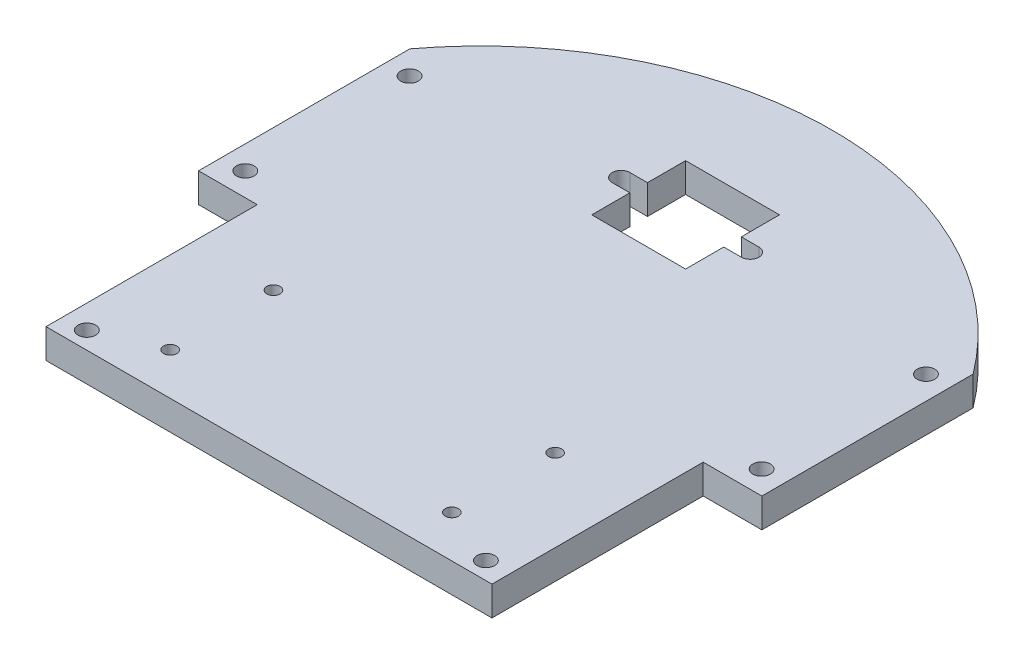
ISO-10303-21;
HEADER;
FILE_DESCRIPTION(('STEP AP214'),'2;1');
FILE_NAME('part.step','',(''),(''),'','','');
FILE_SCHEMA(('AUTOMOTIVE_DESIGN { 1 0 10303 214 1 1 1 1 }'));
ENDSEC;
DATA;
#1=APPLICATION_CONTEXT('core data for automotive mechanical design processes');
#2=APPLICATION_PROTOCOL_DEFINITION('international standard','automotive_design',2000,#1);
#3=PRODUCT_CONTEXT('',#1,'mechanical');
#4=PRODUCT('Part','Part','',(#3));
#5=PRODUCT_RELATED_PRODUCT_CATEGORY('part','',(#4));
#6=PRODUCT_DEFINITION_FORMATION('','',#4);
#7=PRODUCT_DEFINITION_CONTEXT('part definition',#1,'design');
#8=PRODUCT_DEFINITION('design','',#6,#7);
#9=PRODUCT_DEFINITION_SHAPE('','',#8);
#10=(LENGTH_UNIT() NAMED_UNIT(*) SI_UNIT(.MILLI.,.METRE.));
#11=(NAMED_UNIT(*) PLANE_ANGLE_UNIT() SI_UNIT($,.RADIAN.));
#12=(NAMED_UNIT(*) SI_UNIT($,.STERADIAN.) SOLID_ANGLE_UNIT());
#13=UNCERTAINTY_MEASURE_WITH_UNIT(LENGTH_MEASURE(1.E-05),#10,'distance_accuracy_value','');
#14=(GEOMETRIC_REPRESENTATION_CONTEXT(3) GLOBAL_UNCERTAINTY_ASSIGNED_CONTEXT((#13)) GLOBAL_UNIT_ASSIGNED_CONTEXT((#10,
#11,#12)) REPRESENTATION_CONTEXT('',''));
#15=CARTESIAN_POINT('',(0.,0.,0.));
#16=DIRECTION('',(0.,0.,1.));
#17=DIRECTION('',(1.,0.,0.));
#18=AXIS2_PLACEMENT_3D('',#15,#16,#17);
#19=CARTESIAN_POINT('',(0.,5.,15.));
#20=DIRECTION('',(0.,-1.,0.));
#21=DIRECTION('',(0.,0.,-1.));
#22=AXIS2_PLACEMENT_3D('',#19,#20,#21);
#23=PLANE('',#22);
#24=CARTESIAN_POINT('',(24.,5.,43.84));
#25=DIRECTION('',(0.,1.,0.));
#26=DIRECTION('',(0.,0.,1.));
#27=AXIS2_PLACEMENT_3D('',#24,#25,#26);
#28=CIRCLE('',#27,1.125);
#29=CARTESIAN_POINT('',(24.,5.,44.965));
#30=VERTEX_POINT('',#29);
#31=EDGE_CURVE('E263',#30,#30,#28,.T.);
#32=ORIENTED_EDGE('',*,*,#31,.F.);
#33=EDGE_LOOP('',(#32));
#34=FACE_BOUND('',#33,.T.);
#35=CARTESIAN_POINT('',(24.,5.,26.24));
#36=DIRECTION('',(0.,1.,0.));
#37=DIRECTION('',(0.,0.,1.));
#38=AXIS2_PLACEMENT_3D('',#35,#36,#37);
#39=CIRCLE('',#38,1.125);
#40=CARTESIAN_POINT('',(24.,5.,27.365));
#41=VERTEX_POINT('',#40);
#42=EDGE_CURVE('E269',#41,#41,#39,.T.);
#43=ORIENTED_EDGE('',*,*,#42,.F.);
#44=EDGE_LOOP('',(#43));
#45=FACE_BOUND('',#44,.T.);
#46=CARTESIAN_POINT('',(-24.,5.,43.84));
#47=DIRECTION('',(0.,1.,0.));
#48=DIRECTION('',(0.,0.,1.));
#49=AXIS2_PLACEMENT_3D('',#46,#47,#48);
#50=CIRCLE('',#49,1.125);
#51=CARTESIAN_POINT('',(-24.,5.,44.965));
#52=VERTEX_POINT('',#51);
#53=EDGE_CURVE('E275',#52,#52,#50,.T.);
#54=ORIENTED_EDGE('',*,*,#53,.F.);
#55=EDGE_LOOP('',(#54));
#56=FACE_BOUND('',#55,.T.);
#57=CARTESIAN_POINT('',(-24.,5.,26.24));
#58=DIRECTION('',(0.,1.,0.));
#59=DIRECTION('',(0.,0.,1.));
#60=AXIS2_PLACEMENT_3D('',#57,#58,#59);
#61=CIRCLE('',#60,1.125);
#62=CARTESIAN_POINT('',(-24.,5.,27.365));
#63=VERTEX_POINT('',#62);
#64=EDGE_CURVE('E281',#63,#63,#61,.T.);
#65=ORIENTED_EDGE('',*,*,#64,.F.);
#66=EDGE_LOOP('',(#65));
#67=FACE_BOUND('',#66,.T.);
#68=CARTESIAN_POINT('',(44.,5.,11.04));
#69=DIRECTION('',(0.,1.,0.));
#70=DIRECTION('',(0.,0.,1.));
#71=AXIS2_PLACEMENT_3D('',#68,#69,#70);
#72=CIRCLE('',#71,1.5);
#73=CARTESIAN_POINT('',(44.,5.,12.5400000000001));
#74=VERTEX_POINT('',#73);
#75=EDGE_CURVE('E287',#74,#74,#72,.T.);
#76=ORIENTED_EDGE('',*,*,#75,.F.);
#77=EDGE_LOOP('',(#76));
#78=FACE_BOUND('',#77,.T.);
#79=CARTESIAN_POINT('',(44.,5.,-16.96));
#80=DIRECTION('',(0.,1.,0.));
#81=DIRECTION('',(0.,0.,1.));
#82=AXIS2_PLACEMENT_3D('',#79,#80,#81);
#83=CIRCLE('',#82,1.5);
#84=CARTESIAN_POINT('',(44.,5.,-15.4599999999999));
#85=VERTEX_POINT('',#84);
#86=EDGE_CURVE('E293',#85,#85,#83,.T.);
#87=ORIENTED_EDGE('',*,*,#86,.F.);
#88=EDGE_LOOP('',(#87));
#89=FACE_BOUND('',#88,.T.);
#90=CARTESIAN_POINT('',(-44.,5.,-16.96));
#91=DIRECTION('',(0.,1.,0.));
#92=DIRECTION('',(0.,0.,1.));
#93=AXIS2_PLACEMENT_3D('',#90,#91,#92);
#94=CIRCLE('',#93,1.5);
#95=CARTESIAN_POINT('',(-44.,5.,-15.46));
#96=VERTEX_POINT('',#95);
#97=EDGE_CURVE('E299',#96,#96,#94,.T.);
#98=ORIENTED_EDGE('',*,*,#97,.F.);
#99=EDGE_LOOP('',(#98));
#100=FACE_BOUND('',#99,.T.);
#101=CARTESIAN_POINT('',(-44.,5.,11.04));
#102=DIRECTION('',(0.,1.,0.));
#103=DIRECTION('',(0.,0.,1.));
#104=AXIS2_PLACEMENT_3D('',#101,#102,#103);
#105=CIRCLE('',#104,1.5);
#106=CARTESIAN_POINT('',(-44.,5.,12.54));
#107=VERTEX_POINT('',#106);
#108=EDGE_CURVE('E305',#107,#107,#105,.T.);
#109=ORIENTED_EDGE('',*,*,#108,.F.);
#110=EDGE_LOOP('',(#109));
#111=FACE_BOUND('',#110,.T.);
#112=CARTESIAN_POINT('',(-34.,5.,48.04));
#113=DIRECTION('',(0.,1.,0.));
#114=DIRECTION('',(0.,0.,1.));
#115=AXIS2_PLACEMENT_3D('',#112,#113,#114);
#116=CIRCLE('',#115,1.5);
#117=CARTESIAN_POINT('',(-34.,5.,49.54));
#118=VERTEX_POINT('',#117);
#119=EDGE_CURVE('E311',#118,#118,#116,.T.);
#120=ORIENTED_EDGE('',*,*,#119,.F.);
#121=EDGE_LOOP('',(#120));
#122=FACE_BOUND('',#121,.T.);
#123=CARTESIAN_POINT('',(34.,5.,48.04));
#124=DIRECTION('',(0.,1.,0.));
#125=DIRECTION('',(0.,0.,1.));
#126=AXIS2_PLACEMENT_3D('',#123,#124,#125);
#127=CIRCLE('',#126,1.5);
#128=CARTESIAN_POINT('',(34.,5.,49.54));
#129=VERTEX_POINT('',#128);
#130=EDGE_CURVE('E317',#129,#129,#127,.T.);
#131=ORIENTED_EDGE('',*,*,#130,.F.);
#132=EDGE_LOOP('',(#131));
#133=FACE_BOUND('',#132,.T.);
#134=DIRECTION('',(0.,0.,1.));
#135=VECTOR('',#134,1.);
#136=CARTESIAN_POINT('',(-38.,5.,51.));
#137=LINE('',#136,#135);
#138=CARTESIAN_POINT('',(-38.,5.,15.));
#139=VERTEX_POINT('',#138);
#140=CARTESIAN_POINT('',(-38.,5.,51.));
#141=VERTEX_POINT('',#140);
#142=EDGE_CURVE('E323',#139,#141,#137,.T.);
#143=ORIENTED_EDGE('',*,*,#142,.T.);
#144=DIRECTION('',(1.,0.,0.));
#145=VECTOR('',#144,1.);
#146=CARTESIAN_POINT('',(-38.,5.,51.));
#147=LINE('',#146,#145);
#148=CARTESIAN_POINT('',(38.,5.,51.));
#149=VERTEX_POINT('',#148);
#150=EDGE_CURVE('E326',#141,#149,#147,.T.);
#151=ORIENTED_EDGE('',*,*,#150,.T.);
#152=DIRECTION('',(0.,0.,-1.));
#153=VECTOR('',#152,1.);
#154=CARTESIAN_POINT('',(38.,5.,51.));
#155=LINE('',#154,#153);
#156=CARTESIAN_POINT('',(38.,5.,15.));
#157=VERTEX_POINT('',#156);
#158=EDGE_CURVE('E329',#149,#157,#155,.T.);
#159=ORIENTED_EDGE('',*,*,#158,.T.);
#160=DIRECTION('',(1.,0.,0.));
#161=VECTOR('',#160,1.);
#162=CARTESIAN_POINT('',(38.,5.,15.));
#163=LINE('',#162,#161);
#164=CARTESIAN_POINT('',(48.,5.,15.));
#165=VERTEX_POINT('',#164);
#166=EDGE_CURVE('E331',#157,#165,#163,.T.);
#167=ORIENTED_EDGE('',*,*,#166,.T.);
#168=DIRECTION('',(0.,0.,-1.));
#169=VECTOR('',#168,1.);
#170=CARTESIAN_POINT('',(48.,5.,15.));
#171=LINE('',#170,#169);
#172=CARTESIAN_POINT('',(48.,5.,-21.));
#173=VERTEX_POINT('',#172);
#174=EDGE_CURVE('E333',#165,#173,#171,.T.);
#175=ORIENTED_EDGE('',*,*,#174,.T.);
#176=CARTESIAN_POINT('',(0.,5.,15.));
#177=DIRECTION('',(0.,1.,0.));
#178=DIRECTION('',(0.,0.,-1.));
#179=AXIS2_PLACEMENT_3D('',#176,#177,#178);
#180=CIRCLE('',#179,60.);
#181=CARTESIAN_POINT('',(-48.,5.,-20.9999999999999));
#182=VERTEX_POINT('',#181);
#183=EDGE_CURVE('E335',#173,#182,#180,.T.);
#184=ORIENTED_EDGE('',*,*,#183,.T.);
#185=DIRECTION('',(0.,0.,1.));
#186=VECTOR('',#185,1.);
#187=CARTESIAN_POINT('',(-48.,5.,15.));
#188=LINE('',#187,#186);
#189=CARTESIAN_POINT('',(-48.,5.,15.));
#190=VERTEX_POINT('',#189);
#191=EDGE_CURVE('E337',#182,#190,#188,.T.);
#192=ORIENTED_EDGE('',*,*,#191,.T.);
#193=DIRECTION('',(1.,0.,0.));
#194=VECTOR('',#193,1.);
#195=CARTESIAN_POINT('',(-38.,5.,15.));
#196=LINE('',#195,#194);
#197=EDGE_CURVE('E339',#190,#139,#196,.T.);
#198=ORIENTED_EDGE('',*,*,#197,.T.);
#199=EDGE_LOOP('',(#143,#151,#159,#167,#175,#184,#192,#198));
#200=FACE_BOUND('',#199,.T.);
#201=DIRECTION('',(0.,0.,1.));
#202=VECTOR('',#201,1.);
#203=CARTESIAN_POINT('',(-7.99999999999999,5.,-28.));
#204=LINE('',#203,#202);
#205=CARTESIAN_POINT('',(-7.99999999999999,5.,-28.));
#206=VERTEX_POINT('',#205);
#207=CARTESIAN_POINT('',(-7.99999999999999,5.,-21.5));
#208=VERTEX_POINT('',#207);
#209=EDGE_CURVE('E170',#206,#208,#204,.T.);
#210=ORIENTED_EDGE('',*,*,#209,.F.);
#211=DIRECTION('',(-1.,0.,0.));
#212=VECTOR('',#211,1.);
#213=CARTESIAN_POINT('',(-7.99999999999999,5.,-28.));
#214=LINE('',#213,#212);
#215=CARTESIAN_POINT('',(8.00000000000001,5.,-28.));
#216=VERTEX_POINT('',#215);
#217=EDGE_CURVE('E211',#216,#206,#214,.T.);
#218=ORIENTED_EDGE('',*,*,#217,.F.);
#219=DIRECTION('',(0.,0.,-1.));
#220=VECTOR('',#219,1.);
#221=CARTESIAN_POINT('',(8.00000000000001,5.,-28.));
#222=LINE('',#221,#220);
#223=CARTESIAN_POINT('',(8.00000000000001,5.,-21.5));
#224=VERTEX_POINT('',#223);
#225=EDGE_CURVE('E209',#224,#216,#222,.T.);
#226=ORIENTED_EDGE('',*,*,#225,.F.);
#227=DIRECTION('',(-1.,0.,0.));
#228=VECTOR('',#227,1.);
#229=CARTESIAN_POINT('',(8.00000000000001,5.,-21.5));
#230=LINE('',#229,#228);
#231=CARTESIAN_POINT('',(11.,5.,-21.5));
#232=VERTEX_POINT('',#231);
#233=EDGE_CURVE('E207',#232,#224,#230,.T.);
#234=ORIENTED_EDGE('',*,*,#233,.F.);
#235=CARTESIAN_POINT('',(11.,5.,-20.));
#236=DIRECTION('',(0.,1.,0.));
#237=DIRECTION('',(0.,0.,-1.));
#238=AXIS2_PLACEMENT_3D('',#235,#236,#237);
#239=CIRCLE('',#238,1.5);
#240=CARTESIAN_POINT('',(11.,5.,-18.5));
#241=VERTEX_POINT('',#240);
#242=EDGE_CURVE('E205',#241,#232,#239,.T.);
#243=ORIENTED_EDGE('',*,*,#242,.F.);
#244=DIRECTION('',(1.,0.,0.));
#245=VECTOR('',#244,1.);
#246=CARTESIAN_POINT('',(11.,5.,-18.5));
#247=LINE('',#246,#245);
#248=CARTESIAN_POINT('',(8.00000000000001,5.,-18.5));
#249=VERTEX_POINT('',#248);
#250=EDGE_CURVE('E203',#249,#241,#247,.T.);
#251=ORIENTED_EDGE('',*,*,#250,.F.);
#252=DIRECTION('',(0.,0.,-1.));
#253=VECTOR('',#252,1.);
#254=CARTESIAN_POINT('',(8.00000000000001,5.,-18.5));
#255=LINE('',#254,#253);
#256=CARTESIAN_POINT('',(8.00000000000001,5.,-12.));
#257=VERTEX_POINT('',#256);
#258=EDGE_CURVE('E201',#257,#249,#255,.T.);
#259=ORIENTED_EDGE('',*,*,#258,.F.);
#260=DIRECTION('',(1.,0.,0.));
#261=VECTOR('',#260,1.);
#262=CARTESIAN_POINT('',(8.00000000000001,5.,-12.));
#263=LINE('',#262,#261);
#264=CARTESIAN_POINT('',(-7.99999999999999,5.,-12.));
#265=VERTEX_POINT('',#264);
#266=EDGE_CURVE('E199',#265,#257,#263,.T.);
#267=ORIENTED_EDGE('',*,*,#266,.F.);
#268=DIRECTION('',(0.,0.,1.));
#269=VECTOR('',#268,1.);
#270=CARTESIAN_POINT('',(-7.99999999999999,5.,-12.));
#271=LINE('',#270,#269);
#272=CARTESIAN_POINT('',(-7.99999999999999,5.,-18.5));
#273=VERTEX_POINT('',#272);
#274=EDGE_CURVE('E197',#273,#265,#271,.T.);
#275=ORIENTED_EDGE('',*,*,#274,.F.);
#276=DIRECTION('',(1.,0.,0.));
#277=VECTOR('',#276,1.);
#278=CARTESIAN_POINT('',(-7.99999999999999,5.,-18.5));
#279=LINE('',#278,#277);
#280=CARTESIAN_POINT('',(-11.,5.,-18.5));
#281=VERTEX_POINT('',#280);
#282=EDGE_CURVE('E193',#281,#273,#279,.T.);
#283=ORIENTED_EDGE('',*,*,#282,.F.);
#284=CARTESIAN_POINT('',(-11.,5.,-20.));
#285=DIRECTION('',(0.,1.,0.));
#286=DIRECTION('',(0.,0.,1.));
#287=AXIS2_PLACEMENT_3D('',#284,#285,#286);
#288=CIRCLE('',#287,1.5);
#289=CARTESIAN_POINT('',(-11.,5.,-21.5));
#290=VERTEX_POINT('',#289);
#291=EDGE_CURVE('E191',#290,#281,#288,.T.);
#292=ORIENTED_EDGE('',*,*,#291,.F.);
#293=DIRECTION('',(-1.,0.,0.));
#294=VECTOR('',#293,1.);
#295=CARTESIAN_POINT('',(-7.99999999999999,5.,-21.5));
#296=LINE('',#295,#294);
#297=EDGE_CURVE('E178',#208,#290,#296,.T.);
#298=ORIENTED_EDGE('',*,*,#297,.F.);
#299=EDGE_LOOP('',(#210,#218,#226,#234,#243,#251,#259,#267,#275,#283,#292,#298));
#300=FACE_BOUND('',#299,.T.);
#301=ADVANCED_FACE('F33',(#34,#45,#56,#67,#78,#89,#100,#111,#122,#133,#200,#300),#23,.F.);
#302=CARTESIAN_POINT('',(0.,0.,15.));
#303=DIRECTION('',(0.,-1.,0.));
#304=DIRECTION('',(0.,0.,-1.));
#305=AXIS2_PLACEMENT_3D('',#302,#303,#304);
#306=PLANE('',#305);
#307=CARTESIAN_POINT('',(24.,0.,26.24));
#308=DIRECTION('',(0.,1.,0.));
#309=DIRECTION('',(0.,0.,1.));
#310=AXIS2_PLACEMENT_3D('',#307,#308,#309);
#311=CIRCLE('',#310,1.125);
#312=CARTESIAN_POINT('',(24.,0.,27.365));
#313=VERTEX_POINT('',#312);
#314=EDGE_CURVE('E266',#313,#313,#311,.T.);
#315=ORIENTED_EDGE('',*,*,#314,.T.);
#316=EDGE_LOOP('',(#315));
#317=FACE_BOUND('',#316,.T.);
#318=CARTESIAN_POINT('',(-24.,0.,26.24));
#319=DIRECTION('',(0.,1.,0.));
#320=DIRECTION('',(0.,0.,1.));
#321=AXIS2_PLACEMENT_3D('',#318,#319,#320);
#322=CIRCLE('',#321,1.125);
#323=CARTESIAN_POINT('',(-24.,0.,27.365));
#324=VERTEX_POINT('',#323);
#325=EDGE_CURVE('E278',#324,#324,#322,.T.);
#326=ORIENTED_EDGE('',*,*,#325,.T.);
#327=EDGE_LOOP('',(#326));
#328=FACE_BOUND('',#327,.T.);
#329=CARTESIAN_POINT('',(44.,0.,-16.96));
#330=DIRECTION('',(0.,1.,0.));
#331=DIRECTION('',(0.,0.,1.));
#332=AXIS2_PLACEMENT_3D('',#329,#330,#331);
#333=CIRCLE('',#332,1.5);
#334=CARTESIAN_POINT('',(44.,0.,-15.4599999999999));
#335=VERTEX_POINT('',#334);
#336=EDGE_CURVE('E290',#335,#335,#333,.T.);
#337=ORIENTED_EDGE('',*,*,#336,.T.);
#338=EDGE_LOOP('',(#337));
#339=FACE_BOUND('',#338,.T.);
#340=CARTESIAN_POINT('',(-44.,0.,11.04));
#341=DIRECTION('',(0.,1.,0.));
#342=DIRECTION('',(0.,0.,1.));
#343=AXIS2_PLACEMENT_3D('',#340,#341,#342);
#344=CIRCLE('',#343,1.5);
#345=CARTESIAN_POINT('',(-44.,0.,12.54));
#346=VERTEX_POINT('',#345);
#347=EDGE_CURVE('E302',#346,#346,#344,.T.);
#348=ORIENTED_EDGE('',*,*,#347,.T.);
#349=EDGE_LOOP('',(#348));
#350=FACE_BOUND('',#349,.T.);
#351=CARTESIAN_POINT('',(34.,0.,48.04));
#352=DIRECTION('',(0.,1.,0.));
#353=DIRECTION('',(0.,0.,1.));
#354=AXIS2_PLACEMENT_3D('',#351,#352,#353);
#355=CIRCLE('',#354,1.5);
#356=CARTESIAN_POINT('',(34.,0.,49.54));
#357=VERTEX_POINT('',#356);
#358=EDGE_CURVE('E314',#357,#357,#355,.T.);
#359=ORIENTED_EDGE('',*,*,#358,.T.);
#360=EDGE_LOOP('',(#359));
#361=FACE_BOUND('',#360,.T.);
#362=DIRECTION('',(0.,0.,1.));
#363=VECTOR('',#362,1.);
#364=CARTESIAN_POINT('',(-38.,0.,51.));
#365=LINE('',#364,#363);
#366=CARTESIAN_POINT('',(-38.,0.,15.));
#367=VERTEX_POINT('',#366);
#368=CARTESIAN_POINT('',(-38.,0.,51.));
#369=VERTEX_POINT('',#368);
#370=EDGE_CURVE('E320',#367,#369,#365,.T.);
#371=ORIENTED_EDGE('',*,*,#370,.F.);
#372=DIRECTION('',(1.,0.,0.));
#373=VECTOR('',#372,1.);
#374=CARTESIAN_POINT('',(-38.,0.,15.));
#375=LINE('',#374,#373);
#376=CARTESIAN_POINT('',(-48.,0.,15.));
#377=VERTEX_POINT('',#376);
#378=EDGE_CURVE('E327',#377,#367,#375,.T.);
#379=ORIENTED_EDGE('',*,*,#378,.F.);
#380=DIRECTION('',(0.,0.,1.));
#381=VECTOR('',#380,1.);
#382=CARTESIAN_POINT('',(-48.,0.,15.));
#383=LINE('',#382,#381);
#384=CARTESIAN_POINT('',(-48.,0.,-20.9999999999999));
#385=VERTEX_POINT('',#384);
#386=EDGE_CURVE('E354',#385,#377,#383,.T.);
#387=ORIENTED_EDGE('',*,*,#386,.F.);
#388=CARTESIAN_POINT('',(0.,0.,15.));
#389=DIRECTION('',(0.,1.,0.));
#390=DIRECTION('',(0.,0.,-1.));
#391=AXIS2_PLACEMENT_3D('',#388,#389,#390);
#392=CIRCLE('',#391,60.);
#393=CARTESIAN_POINT('',(48.,0.,-21.));
#394=VERTEX_POINT('',#393);
#395=EDGE_CURVE('E352',#394,#385,#392,.T.);
#396=ORIENTED_EDGE('',*,*,#395,.F.);
#397=DIRECTION('',(0.,0.,-1.));
#398=VECTOR('',#397,1.);
#399=CARTESIAN_POINT('',(48.,0.,15.));
#400=LINE('',#399,#398);
#401=CARTESIAN_POINT('',(48.,0.,15.));
#402=VERTEX_POINT('',#401);
#403=EDGE_CURVE('E350',#402,#394,#400,.T.);
#404=ORIENTED_EDGE('',*,*,#403,.F.);
#405=DIRECTION('',(1.,0.,0.));
#406=VECTOR('',#405,1.);
#407=CARTESIAN_POINT('',(38.,0.,15.));
#408=LINE('',#407,#406);
#409=CARTESIAN_POINT('',(38.,0.,15.));
#410=VERTEX_POINT('',#409);
#411=EDGE_CURVE('E348',#410,#402,#408,.T.);
#412=ORIENTED_EDGE('',*,*,#411,.F.);
#413=DIRECTION('',(0.,0.,-1.));
#414=VECTOR('',#413,1.);
#415=CARTESIAN_POINT('',(38.,0.,51.));
#416=LINE('',#415,#414);
#417=CARTESIAN_POINT('',(38.,0.,51.));
#418=VERTEX_POINT('',#417);
#419=EDGE_CURVE('E346',#418,#410,#416,.T.);
#420=ORIENTED_EDGE('',*,*,#419,.F.);
#421=DIRECTION('',(1.,0.,0.));
#422=VECTOR('',#421,1.);
#423=CARTESIAN_POINT('',(-38.,0.,51.));
#424=LINE('',#423,#422);
#425=EDGE_CURVE('E344',#369,#418,#424,.T.);
#426=ORIENTED_EDGE('',*,*,#425,.F.);
#427=EDGE_LOOP('',(#371,#379,#387,#396,#404,#412,#420,#426));
#428=FACE_BOUND('',#427,.T.);
#429=CARTESIAN_POINT('',(-34.,0.,48.04));
#430=DIRECTION('',(0.,1.,0.));
#431=DIRECTION('',(0.,0.,1.));
#432=AXIS2_PLACEMENT_3D('',#429,#430,#431);
#433=CIRCLE('',#432,1.5);
#434=CARTESIAN_POINT('',(-34.,0.,49.54));
#435=VERTEX_POINT('',#434);
#436=EDGE_CURVE('E308',#435,#435,#433,.T.);
#437=ORIENTED_EDGE('',*,*,#436,.T.);
#438=EDGE_LOOP('',(#437));
#439=FACE_BOUND('',#438,.T.);
#440=CARTESIAN_POINT('',(-44.,0.,-16.96));
#441=DIRECTION('',(0.,1.,0.));
#442=DIRECTION('',(0.,0.,1.));
#443=AXIS2_PLACEMENT_3D('',#440,#441,#442);
#444=CIRCLE('',#443,1.5);
#445=CARTESIAN_POINT('',(-44.,0.,-15.46));
#446=VERTEX_POINT('',#445);
#447=EDGE_CURVE('E296',#446,#446,#444,.T.);
#448=ORIENTED_EDGE('',*,*,#447,.T.);
#449=EDGE_LOOP('',(#448));
#450=FACE_BOUND('',#449,.T.);
#451=CARTESIAN_POINT('',(44.,0.,11.04));
#452=DIRECTION('',(0.,1.,0.));
#453=DIRECTION('',(0.,0.,1.));
#454=AXIS2_PLACEMENT_3D('',#451,#452,#453);
#455=CIRCLE('',#454,1.5);
#456=CARTESIAN_POINT('',(44.,0.,12.5400000000001));
#457=VERTEX_POINT('',#456);
#458=EDGE_CURVE('E284',#457,#457,#455,.T.);
#459=ORIENTED_EDGE('',*,*,#458,.T.);
#460=EDGE_LOOP('',(#459));
#461=FACE_BOUND('',#460,.T.);
#462=CARTESIAN_POINT('',(-24.,0.,43.84));
#463=DIRECTION('',(0.,1.,0.));
#464=DIRECTION('',(0.,0.,1.));
#465=AXIS2_PLACEMENT_3D('',#462,#463,#464);
#466=CIRCLE('',#465,1.125);
#467=CARTESIAN_POINT('',(-24.,0.,44.965));
#468=VERTEX_POINT('',#467);
#469=EDGE_CURVE('E272',#468,#468,#466,.T.);
#470=ORIENTED_EDGE('',*,*,#469,.T.);
#471=EDGE_LOOP('',(#470));
#472=FACE_BOUND('',#471,.T.);
#473=CARTESIAN_POINT('',(24.,0.,43.84));
#474=DIRECTION('',(0.,1.,0.));
#475=DIRECTION('',(0.,0.,1.));
#476=AXIS2_PLACEMENT_3D('',#473,#474,#475);
#477=CIRCLE('',#476,1.125);
#478=CARTESIAN_POINT('',(24.,0.,44.965));
#479=VERTEX_POINT('',#478);
#480=EDGE_CURVE('E186',#479,#479,#477,.T.);
#481=ORIENTED_EDGE('',*,*,#480,.T.);
#482=EDGE_LOOP('',(#481));
#483=FACE_BOUND('',#482,.T.);
#484=DIRECTION('',(-1.,0.,0.));
#485=VECTOR('',#484,1.);
#486=CARTESIAN_POINT('',(-7.99999999999999,0.,-28.));
#487=LINE('',#486,#485);
#488=CARTESIAN_POINT('',(8.00000000000001,0.,-28.));
#489=VERTEX_POINT('',#488);
#490=CARTESIAN_POINT('',(-7.99999999999999,0.,-28.));
#491=VERTEX_POINT('',#490);
#492=EDGE_CURVE('E179',#489,#491,#487,.T.);
#493=ORIENTED_EDGE('',*,*,#492,.T.);
#494=DIRECTION('',(0.,0.,1.));
#495=VECTOR('',#494,1.);
#496=CARTESIAN_POINT('',(-7.99999999999999,0.,-28.));
#497=LINE('',#496,#495);
#498=CARTESIAN_POINT('',(-7.99999999999999,0.,-21.5));
#499=VERTEX_POINT('',#498);
#500=EDGE_CURVE('E56',#491,#499,#497,.T.);
#501=ORIENTED_EDGE('',*,*,#500,.T.);
#502=DIRECTION('',(-1.,0.,0.));
#503=VECTOR('',#502,1.);
#504=CARTESIAN_POINT('',(-7.99999999999999,0.,-21.5));
#505=LINE('',#504,#503);
#506=CARTESIAN_POINT('',(-11.,0.,-21.5));
#507=VERTEX_POINT('',#506);
#508=EDGE_CURVE('E185',#499,#507,#505,.T.);
#509=ORIENTED_EDGE('',*,*,#508,.T.);
#510=CARTESIAN_POINT('',(-11.,0.,-20.));
#511=DIRECTION('',(0.,1.,0.));
#512=DIRECTION('',(0.,0.,1.));
#513=AXIS2_PLACEMENT_3D('',#510,#511,#512);
#514=CIRCLE('',#513,1.5);
#515=CARTESIAN_POINT('',(-11.,0.,-18.5));
#516=VERTEX_POINT('',#515);
#517=EDGE_CURVE('E215',#507,#516,#514,.T.);
#518=ORIENTED_EDGE('',*,*,#517,.T.);
#519=DIRECTION('',(1.,0.,0.));
#520=VECTOR('',#519,1.);
#521=CARTESIAN_POINT('',(-7.99999999999999,0.,-18.5));
#522=LINE('',#521,#520);
#523=CARTESIAN_POINT('',(-7.99999999999999,0.,-18.5));
#524=VERTEX_POINT('',#523);
#525=EDGE_CURVE('E218',#516,#524,#522,.T.);
#526=ORIENTED_EDGE('',*,*,#525,.T.);
#527=DIRECTION('',(0.,0.,1.));
#528=VECTOR('',#527,1.);
#529=CARTESIAN_POINT('',(-7.99999999999999,0.,-12.));
#530=LINE('',#529,#528);
#531=CARTESIAN_POINT('',(-7.99999999999999,0.,-12.));
#532=VERTEX_POINT('',#531);
#533=EDGE_CURVE('E221',#524,#532,#530,.T.);
#534=ORIENTED_EDGE('',*,*,#533,.T.);
#535=DIRECTION('',(1.,0.,0.));
#536=VECTOR('',#535,1.);
#537=CARTESIAN_POINT('',(8.00000000000001,0.,-12.));
#538=LINE('',#537,#536);
#539=CARTESIAN_POINT('',(8.00000000000001,0.,-12.));
#540=VERTEX_POINT('',#539);
#541=EDGE_CURVE('E224',#532,#540,#538,.T.);
#542=ORIENTED_EDGE('',*,*,#541,.T.);
#543=DIRECTION('',(0.,0.,-1.));
#544=VECTOR('',#543,1.);
#545=CARTESIAN_POINT('',(8.00000000000001,0.,-18.5));
#546=LINE('',#545,#544);
#547=CARTESIAN_POINT('',(8.00000000000001,0.,-18.5));
#548=VERTEX_POINT('',#547);
#549=EDGE_CURVE('E227',#540,#548,#546,.T.);
#550=ORIENTED_EDGE('',*,*,#549,.T.);
#551=DIRECTION('',(1.,0.,0.));
#552=VECTOR('',#551,1.);
#553=CARTESIAN_POINT('',(11.,0.,-18.5));
#554=LINE('',#553,#552);
#555=CARTESIAN_POINT('',(11.,0.,-18.5));
#556=VERTEX_POINT('',#555);
#557=EDGE_CURVE('E230',#548,#556,#554,.T.);
#558=ORIENTED_EDGE('',*,*,#557,.T.);
#559=CARTESIAN_POINT('',(11.,0.,-20.));
#560=DIRECTION('',(0.,1.,0.));
#561=DIRECTION('',(0.,0.,-1.));
#562=AXIS2_PLACEMENT_3D('',#559,#560,#561);
#563=CIRCLE('',#562,1.5);
#564=CARTESIAN_POINT('',(11.,0.,-21.5));
#565=VERTEX_POINT('',#564);
#566=EDGE_CURVE('E233',#556,#565,#563,.T.);
#567=ORIENTED_EDGE('',*,*,#566,.T.);
#568=DIRECTION('',(-1.,0.,0.));
#569=VECTOR('',#568,1.);
#570=CARTESIAN_POINT('',(8.00000000000001,0.,-21.5));
#571=LINE('',#570,#569);
#572=CARTESIAN_POINT('',(8.00000000000001,0.,-21.5));
#573=VERTEX_POINT('',#572);
#574=EDGE_CURVE('E236',#565,#573,#571,.T.);
#575=ORIENTED_EDGE('',*,*,#574,.T.);
#576=DIRECTION('',(0.,0.,-1.));
#577=VECTOR('',#576,1.);
#578=CARTESIAN_POINT('',(8.00000000000001,0.,-28.));
#579=LINE('',#578,#577);
#580=EDGE_CURVE('E239',#573,#489,#579,.T.);
#581=ORIENTED_EDGE('',*,*,#580,.T.);
#582=EDGE_LOOP('',(#493,#501,#509,#518,#526,#534,#542,#550,#558,#567,#575,#581));
#583=FACE_BOUND('',#582,.T.);
#584=ADVANCED_FACE('F384',(#317,#328,#339,#350,#361,#428,#439,#450,#461,#472,#483,#583),#306,.T.);
#585=CARTESIAN_POINT('',(-38.,5.,51.));
#586=DIRECTION('',(1.,0.,0.));
#587=DIRECTION('',(0.,0.,-1.));
#588=AXIS2_PLACEMENT_3D('',#585,#586,#587);
#589=PLANE('',#588);
#590=ORIENTED_EDGE('',*,*,#370,.T.);
#591=DIRECTION('',(0.,-1.,0.));
#592=VECTOR('',#591,1.);
#593=CARTESIAN_POINT('',(-38.,5.,51.));
#594=LINE('',#593,#592);
#595=EDGE_CURVE('E11',#141,#369,#594,.T.);
#596=ORIENTED_EDGE('',*,*,#595,.F.);
#597=ORIENTED_EDGE('',*,*,#142,.F.);
#598=DIRECTION('',(0.,-1.,0.));
#599=VECTOR('',#598,1.);
#600=CARTESIAN_POINT('',(-38.,5.,15.));
#601=LINE('',#600,#599);
#602=EDGE_CURVE('E341',#139,#367,#601,.T.);
#603=ORIENTED_EDGE('',*,*,#602,.T.);
#604=EDGE_LOOP('',(#590,#596,#597,#603));
#605=FACE_BOUND('',#604,.T.);
#606=ADVANCED_FACE('F35',(#605),#589,.F.);
#607=CARTESIAN_POINT('',(-38.,5.,51.));
#608=DIRECTION('',(0.,0.,-1.));
#609=DIRECTION('',(-1.,0.,0.));
#610=AXIS2_PLACEMENT_3D('',#607,#608,#609);
#611=PLANE('',#610);
#612=ORIENTED_EDGE('',*,*,#425,.T.);
#613=DIRECTION('',(0.,-1.,0.));
#614=VECTOR('',#613,1.);
#615=CARTESIAN_POINT('',(38.,5.,51.));
#616=LINE('',#615,#614);
#617=EDGE_CURVE('E41',#149,#418,#616,.T.);
#618=ORIENTED_EDGE('',*,*,#617,.F.);
#619=ORIENTED_EDGE('',*,*,#150,.F.);
#620=ORIENTED_EDGE('',*,*,#595,.T.);
#621=EDGE_LOOP('',(#612,#618,#619,#620));
#622=FACE_BOUND('',#621,.T.);
#623=ADVANCED_FACE('F401',(#622),#611,.F.);
#624=CARTESIAN_POINT('',(38.,5.,51.));
#625=DIRECTION('',(-1.,0.,0.));
#626=DIRECTION('',(0.,0.,1.));
#627=AXIS2_PLACEMENT_3D('',#624,#625,#626);
#628=PLANE('',#627);
#629=ORIENTED_EDGE('',*,*,#419,.T.);
#630=DIRECTION('',(0.,-1.,0.));
#631=VECTOR('',#630,1.);
#632=CARTESIAN_POINT('',(38.,5.,15.));
#633=LINE('',#632,#631);
#634=EDGE_CURVE('E371',#157,#410,#633,.T.);
#635=ORIENTED_EDGE('',*,*,#634,.F.);
#636=ORIENTED_EDGE('',*,*,#158,.F.);
#637=ORIENTED_EDGE('',*,*,#617,.T.);
#638=EDGE_LOOP('',(#629,#635,#636,#637));
#639=FACE_BOUND('',#638,.T.);
#640=ADVANCED_FACE('F378',(#639),#628,.F.);
#641=CARTESIAN_POINT('',(38.,5.,15.));
#642=DIRECTION('',(0.,0.,-1.));
#643=DIRECTION('',(-1.,0.,0.));
#644=AXIS2_PLACEMENT_3D('',#641,#642,#643);
#645=PLANE('',#644);
#646=ORIENTED_EDGE('',*,*,#411,.T.);
#647=DIRECTION('',(0.,-1.,0.));
#648=VECTOR('',#647,1.);
#649=CARTESIAN_POINT('',(48.,5.,15.));
#650=LINE('',#649,#648);
#651=EDGE_CURVE('E368',#165,#402,#650,.T.);
#652=ORIENTED_EDGE('',*,*,#651,.F.);
#653=ORIENTED_EDGE('',*,*,#166,.F.);
#654=ORIENTED_EDGE('',*,*,#634,.T.);
#655=EDGE_LOOP('',(#646,#652,#653,#654));
#656=FACE_BOUND('',#655,.T.);
#657=ADVANCED_FACE('F390',(#656),#645,.F.);
#658=CARTESIAN_POINT('',(48.,5.,15.));
#659=DIRECTION('',(-1.,0.,0.));
#660=DIRECTION('',(0.,0.,1.));
#661=AXIS2_PLACEMENT_3D('',#658,#659,#660);
#662=PLANE('',#661);
#663=ORIENTED_EDGE('',*,*,#403,.T.);
#664=DIRECTION('',(0.,-1.,0.));
#665=VECTOR('',#664,1.);
#666=CARTESIAN_POINT('',(48.,5.,-21.));
#667=LINE('',#666,#665);
#668=EDGE_CURVE('E365',#173,#394,#667,.T.);
#669=ORIENTED_EDGE('',*,*,#668,.F.);
#670=ORIENTED_EDGE('',*,*,#174,.F.);
#671=ORIENTED_EDGE('',*,*,#651,.T.);
#672=EDGE_LOOP('',(#663,#669,#670,#671));
#673=FACE_BOUND('',#672,.T.);
#674=ADVANCED_FACE('F394',(#673),#662,.F.);
#675=CARTESIAN_POINT('',(0.,5.,15.));
#676=DIRECTION('',(0.,-1.,0.));
#677=DIRECTION('',(0.,0.,-1.));
#678=AXIS2_PLACEMENT_3D('',#675,#676,#677);
#679=CYLINDRICAL_SURFACE('',#678,60.);
#680=ORIENTED_EDGE('',*,*,#395,.T.);
#681=DIRECTION('',(0.,-1.,0.));
#682=VECTOR('',#681,1.);
#683=CARTESIAN_POINT('',(-48.,5.,-20.9999999999999));
#684=LINE('',#683,#682);
#685=EDGE_CURVE('E362',#182,#385,#684,.T.);
#686=ORIENTED_EDGE('',*,*,#685,.F.);
#687=ORIENTED_EDGE('',*,*,#183,.F.);
#688=ORIENTED_EDGE('',*,*,#668,.T.);
#689=EDGE_LOOP('',(#680,#686,#687,#688));
#690=FACE_BOUND('',#689,.T.);
#691=ADVANCED_FACE('F414',(#690),#679,.T.);
#692=CARTESIAN_POINT('',(-48.,5.,15.));
#693=DIRECTION('',(1.,0.,0.));
#694=DIRECTION('',(0.,0.,-1.));
#695=AXIS2_PLACEMENT_3D('',#692,#693,#694);
#696=PLANE('',#695);
#697=ORIENTED_EDGE('',*,*,#386,.T.);
#698=DIRECTION('',(0.,-1.,0.));
#699=VECTOR('',#698,1.);
#700=CARTESIAN_POINT('',(-48.,5.,15.));
#701=LINE('',#700,#699);
#702=EDGE_CURVE('E359',#190,#377,#701,.T.);
#703=ORIENTED_EDGE('',*,*,#702,.F.);
#704=ORIENTED_EDGE('',*,*,#191,.F.);
#705=ORIENTED_EDGE('',*,*,#685,.T.);
#706=EDGE_LOOP('',(#697,#703,#704,#705));
#707=FACE_BOUND('',#706,.T.);
#708=ADVANCED_FACE('F412',(#707),#696,.F.);
#709=CARTESIAN_POINT('',(-38.,5.,15.));
#710=DIRECTION('',(0.,0.,-1.));
#711=DIRECTION('',(-1.,0.,0.));
#712=AXIS2_PLACEMENT_3D('',#709,#710,#711);
#713=PLANE('',#712);
#714=ORIENTED_EDGE('',*,*,#378,.T.);
#715=ORIENTED_EDGE('',*,*,#602,.F.);
#716=ORIENTED_EDGE('',*,*,#197,.F.);
#717=ORIENTED_EDGE('',*,*,#702,.T.);
#718=EDGE_LOOP('',(#714,#715,#716,#717));
#719=FACE_BOUND('',#718,.T.);
#720=ADVANCED_FACE('F407',(#719),#713,.F.);
#721=CARTESIAN_POINT('',(34.,5.,48.04));
#722=DIRECTION('',(0.,-1.,0.));
#723=DIRECTION('',(0.,0.,-1.));
#724=AXIS2_PLACEMENT_3D('',#721,#722,#723);
#725=CYLINDRICAL_SURFACE('',#724,1.5);
#726=ORIENTED_EDGE('',*,*,#130,.T.);
#727=EDGE_LOOP('',(#726));
#728=FACE_BOUND('',#727,.T.);
#729=ORIENTED_EDGE('',*,*,#358,.F.);
#730=EDGE_LOOP('',(#729));
#731=FACE_BOUND('',#730,.T.);
#732=ADVANCED_FACE('F434',(#728,#731),#725,.F.);
#733=CARTESIAN_POINT('',(-34.,5.,48.04));
#734=DIRECTION('',(0.,-1.,0.));
#735=DIRECTION('',(0.,0.,-1.));
#736=AXIS2_PLACEMENT_3D('',#733,#734,#735);
#737=CYLINDRICAL_SURFACE('',#736,1.5);
#738=ORIENTED_EDGE('',*,*,#119,.T.);
#739=EDGE_LOOP('',(#738));
#740=FACE_BOUND('',#739,.T.);
#741=ORIENTED_EDGE('',*,*,#436,.F.);
#742=EDGE_LOOP('',(#741));
#743=FACE_BOUND('',#742,.T.);
#744=ADVANCED_FACE('F441',(#740,#743),#737,.F.);
#745=CARTESIAN_POINT('',(-44.,5.,11.04));
#746=DIRECTION('',(0.,-1.,0.));
#747=DIRECTION('',(0.,0.,-1.));
#748=AXIS2_PLACEMENT_3D('',#745,#746,#747);
#749=CYLINDRICAL_SURFACE('',#748,1.5);
#750=ORIENTED_EDGE('',*,*,#108,.T.);
#751=EDGE_LOOP('',(#750));
#752=FACE_BOUND('',#751,.T.);
#753=ORIENTED_EDGE('',*,*,#347,.F.);
#754=EDGE_LOOP('',(#753));
#755=FACE_BOUND('',#754,.T.);
#756=ADVANCED_FACE('F446',(#752,#755),#749,.F.);
#757=CARTESIAN_POINT('',(-44.,5.,-16.96));
#758=DIRECTION('',(0.,-1.,0.));
#759=DIRECTION('',(0.,0.,-1.));
#760=AXIS2_PLACEMENT_3D('',#757,#758,#759);
#761=CYLINDRICAL_SURFACE('',#760,1.5);
#762=ORIENTED_EDGE('',*,*,#97,.T.);
#763=EDGE_LOOP('',(#762));
#764=FACE_BOUND('',#763,.T.);
#765=ORIENTED_EDGE('',*,*,#447,.F.);
#766=EDGE_LOOP('',(#765));
#767=FACE_BOUND('',#766,.T.);
#768=ADVANCED_FACE('F456',(#764,#767),#761,.F.);
#769=CARTESIAN_POINT('',(44.,5.,-16.96));
#770=DIRECTION('',(0.,-1.,0.));
#771=DIRECTION('',(0.,0.,-1.));
#772=AXIS2_PLACEMENT_3D('',#769,#770,#771);
#773=CYLINDRICAL_SURFACE('',#772,1.5);
#774=ORIENTED_EDGE('',*,*,#86,.T.);
#775=EDGE_LOOP('',(#774));
#776=FACE_BOUND('',#775,.T.);
#777=ORIENTED_EDGE('',*,*,#336,.F.);
#778=EDGE_LOOP('',(#777));
#779=FACE_BOUND('',#778,.T.);
#780=ADVANCED_FACE('F463',(#776,#779),#773,.F.);
#781=CARTESIAN_POINT('',(44.,5.,11.04));
#782=DIRECTION('',(0.,-1.,0.));
#783=DIRECTION('',(0.,0.,-1.));
#784=AXIS2_PLACEMENT_3D('',#781,#782,#783);
#785=CYLINDRICAL_SURFACE('',#784,1.5);
#786=ORIENTED_EDGE('',*,*,#75,.T.);
#787=EDGE_LOOP('',(#786));
#788=FACE_BOUND('',#787,.T.);
#789=ORIENTED_EDGE('',*,*,#458,.F.);
#790=EDGE_LOOP('',(#789));
#791=FACE_BOUND('',#790,.T.);
#792=ADVANCED_FACE('F467',(#788,#791),#785,.F.);
#793=CARTESIAN_POINT('',(-24.,5.,26.24));
#794=DIRECTION('',(0.,-1.,0.));
#795=DIRECTION('',(0.,0.,-1.));
#796=AXIS2_PLACEMENT_3D('',#793,#794,#795);
#797=CYLINDRICAL_SURFACE('',#796,1.125);
#798=ORIENTED_EDGE('',*,*,#64,.T.);
#799=EDGE_LOOP('',(#798));
#800=FACE_BOUND('',#799,.T.);
#801=ORIENTED_EDGE('',*,*,#325,.F.);
#802=EDGE_LOOP('',(#801));
#803=FACE_BOUND('',#802,.T.);
#804=ADVANCED_FACE('F471',(#800,#803),#797,.F.);
#805=CARTESIAN_POINT('',(-24.,5.,43.84));
#806=DIRECTION('',(0.,-1.,0.));
#807=DIRECTION('',(0.,0.,-1.));
#808=AXIS2_PLACEMENT_3D('',#805,#806,#807);
#809=CYLINDRICAL_SURFACE('',#808,1.125);
#810=ORIENTED_EDGE('',*,*,#53,.T.);
#811=EDGE_LOOP('',(#810));
#812=FACE_BOUND('',#811,.T.);
#813=ORIENTED_EDGE('',*,*,#469,.F.);
#814=EDGE_LOOP('',(#813));
#815=FACE_BOUND('',#814,.T.);
#816=ADVANCED_FACE('F475',(#812,#815),#809,.F.);
#817=CARTESIAN_POINT('',(24.,5.,26.24));
#818=DIRECTION('',(0.,-1.,0.));
#819=DIRECTION('',(0.,0.,-1.));
#820=AXIS2_PLACEMENT_3D('',#817,#818,#819);
#821=CYLINDRICAL_SURFACE('',#820,1.125);
#822=ORIENTED_EDGE('',*,*,#42,.T.);
#823=EDGE_LOOP('',(#822));
#824=FACE_BOUND('',#823,.T.);
#825=ORIENTED_EDGE('',*,*,#314,.F.);
#826=EDGE_LOOP('',(#825));
#827=FACE_BOUND('',#826,.T.);
#828=ADVANCED_FACE('F479',(#824,#827),#821,.F.);
#829=CARTESIAN_POINT('',(24.,5.,43.84));
#830=DIRECTION('',(0.,-1.,0.));
#831=DIRECTION('',(0.,0.,-1.));
#832=AXIS2_PLACEMENT_3D('',#829,#830,#831);
#833=CYLINDRICAL_SURFACE('',#832,1.125);
#834=ORIENTED_EDGE('',*,*,#31,.T.);
#835=EDGE_LOOP('',(#834));
#836=FACE_BOUND('',#835,.T.);
#837=ORIENTED_EDGE('',*,*,#480,.F.);
#838=EDGE_LOOP('',(#837));
#839=FACE_BOUND('',#838,.T.);
#840=ADVANCED_FACE('F483',(#836,#839),#833,.F.);
#841=CARTESIAN_POINT('',(-7.99999999999999,5.,-28.));
#842=DIRECTION('',(1.,0.,0.));
#843=DIRECTION('',(0.,0.,-1.));
#844=AXIS2_PLACEMENT_3D('',#841,#842,#843);
#845=PLANE('',#844);
#846=ORIENTED_EDGE('',*,*,#500,.F.);
#847=DIRECTION('',(0.,-1.,0.));
#848=VECTOR('',#847,1.);
#849=CARTESIAN_POINT('',(-7.99999999999999,5.,-28.));
#850=LINE('',#849,#848);
#851=EDGE_CURVE('E174',#206,#491,#850,.T.);
#852=ORIENTED_EDGE('',*,*,#851,.F.);
#853=ORIENTED_EDGE('',*,*,#209,.T.);
#854=DIRECTION('',(0.,-1.,0.));
#855=VECTOR('',#854,1.);
#856=CARTESIAN_POINT('',(-7.99999999999999,5.,-21.5));
#857=LINE('',#856,#855);
#858=EDGE_CURVE('E173',#208,#499,#857,.T.);
#859=ORIENTED_EDGE('',*,*,#858,.T.);
#860=EDGE_LOOP('',(#846,#852,#853,#859));
#861=FACE_BOUND('',#860,.T.);
#862=ADVANCED_FACE('F172',(#861),#845,.T.);
#863=CARTESIAN_POINT('',(-7.99999999999999,5.,-21.5));
#864=DIRECTION('',(0.,0.,1.));
#865=DIRECTION('',(1.,0.,0.));
#866=AXIS2_PLACEMENT_3D('',#863,#864,#865);
#867=PLANE('',#866);
#868=ORIENTED_EDGE('',*,*,#508,.F.);
#869=ORIENTED_EDGE('',*,*,#858,.F.);
#870=ORIENTED_EDGE('',*,*,#297,.T.);
#871=DIRECTION('',(0.,-1.,0.));
#872=VECTOR('',#871,1.);
#873=CARTESIAN_POINT('',(-11.,5.,-21.5));
#874=LINE('',#873,#872);
#875=EDGE_CURVE('E187',#290,#507,#874,.T.);
#876=ORIENTED_EDGE('',*,*,#875,.T.);
#877=EDGE_LOOP('',(#868,#869,#870,#876));
#878=FACE_BOUND('',#877,.T.);
#879=ADVANCED_FACE('F182',(#878),#867,.T.);
#880=CARTESIAN_POINT('',(-11.,5.,-20.));
#881=DIRECTION('',(0.,-1.,0.));
#882=DIRECTION('',(0.,0.,-1.));
#883=AXIS2_PLACEMENT_3D('',#880,#881,#882);
#884=CYLINDRICAL_SURFACE('',#883,1.5);
#885=ORIENTED_EDGE('',*,*,#517,.F.);
#886=ORIENTED_EDGE('',*,*,#875,.F.);
#887=ORIENTED_EDGE('',*,*,#291,.T.);
#888=DIRECTION('',(0.,-1.,0.));
#889=VECTOR('',#888,1.);
#890=CARTESIAN_POINT('',(-11.,5.,-18.5));
#891=LINE('',#890,#889);
#892=EDGE_CURVE('E260',#281,#516,#891,.T.);
#893=ORIENTED_EDGE('',*,*,#892,.T.);
#894=EDGE_LOOP('',(#885,#886,#887,#893));
#895=FACE_BOUND('',#894,.T.);
#896=ADVANCED_FACE('F492',(#895),#884,.F.);
#897=CARTESIAN_POINT('',(-7.99999999999999,5.,-18.5));
#898=DIRECTION('',(0.,0.,-1.));
#899=DIRECTION('',(-1.,0.,0.));
#900=AXIS2_PLACEMENT_3D('',#897,#898,#899);
#901=PLANE('',#900);
#902=ORIENTED_EDGE('',*,*,#525,.F.);
#903=ORIENTED_EDGE('',*,*,#892,.F.);
#904=ORIENTED_EDGE('',*,*,#282,.T.);
#905=DIRECTION('',(0.,-1.,0.));
#906=VECTOR('',#905,1.);
#907=CARTESIAN_POINT('',(-7.99999999999999,5.,-18.5));
#908=LINE('',#907,#906);
#909=EDGE_CURVE('E258',#273,#524,#908,.T.);
#910=ORIENTED_EDGE('',*,*,#909,.T.);
#911=EDGE_LOOP('',(#902,#903,#904,#910));
#912=FACE_BOUND('',#911,.T.);
#913=ADVANCED_FACE('F495',(#912),#901,.T.);
#914=CARTESIAN_POINT('',(-7.99999999999999,5.,-12.));
#915=DIRECTION('',(1.,0.,0.));
#916=DIRECTION('',(0.,0.,-1.));
#917=AXIS2_PLACEMENT_3D('',#914,#915,#916);
#918=PLANE('',#917);
#919=ORIENTED_EDGE('',*,*,#533,.F.);
#920=ORIENTED_EDGE('',*,*,#909,.F.);
#921=ORIENTED_EDGE('',*,*,#274,.T.);
#922=DIRECTION('',(0.,-1.,0.));
#923=VECTOR('',#922,1.);
#924=CARTESIAN_POINT('',(-7.99999999999999,5.,-12.));
#925=LINE('',#924,#923);
#926=EDGE_CURVE('E256',#265,#532,#925,.T.);
#927=ORIENTED_EDGE('',*,*,#926,.T.);
#928=EDGE_LOOP('',(#919,#920,#921,#927));
#929=FACE_BOUND('',#928,.T.);
#930=ADVANCED_FACE('F499',(#929),#918,.T.);
#931=CARTESIAN_POINT('',(8.00000000000001,5.,-12.));
#932=DIRECTION('',(0.,0.,-1.));
#933=DIRECTION('',(-1.,0.,0.));
#934=AXIS2_PLACEMENT_3D('',#931,#932,#933);
#935=PLANE('',#934);
#936=ORIENTED_EDGE('',*,*,#541,.F.);
#937=ORIENTED_EDGE('',*,*,#926,.F.);
#938=ORIENTED_EDGE('',*,*,#266,.T.);
#939=DIRECTION('',(0.,-1.,0.));
#940=VECTOR('',#939,1.);
#941=CARTESIAN_POINT('',(8.00000000000001,5.,-12.));
#942=LINE('',#941,#940);
#943=EDGE_CURVE('E254',#257,#540,#942,.T.);
#944=ORIENTED_EDGE('',*,*,#943,.T.);
#945=EDGE_LOOP('',(#936,#937,#938,#944));
#946=FACE_BOUND('',#945,.T.);
#947=ADVANCED_FACE('F503',(#946),#935,.T.);
#948=CARTESIAN_POINT('',(8.00000000000001,5.,-18.5));
#949=DIRECTION('',(-1.,0.,0.));
#950=DIRECTION('',(0.,0.,1.));
#951=AXIS2_PLACEMENT_3D('',#948,#949,#950);
#952=PLANE('',#951);
#953=ORIENTED_EDGE('',*,*,#549,.F.);
#954=ORIENTED_EDGE('',*,*,#943,.F.);
#955=ORIENTED_EDGE('',*,*,#258,.T.);
#956=DIRECTION('',(0.,-1.,0.));
#957=VECTOR('',#956,1.);
#958=CARTESIAN_POINT('',(8.00000000000001,5.,-18.5));
#959=LINE('',#958,#957);
#960=EDGE_CURVE('E252',#249,#548,#959,.T.);
#961=ORIENTED_EDGE('',*,*,#960,.T.);
#962=EDGE_LOOP('',(#953,#954,#955,#961));
#963=FACE_BOUND('',#962,.T.);
#964=ADVANCED_FACE('F507',(#963),#952,.T.);
#965=CARTESIAN_POINT('',(11.,5.,-18.5));
#966=DIRECTION('',(0.,0.,-1.));
#967=DIRECTION('',(-1.,0.,0.));
#968=AXIS2_PLACEMENT_3D('',#965,#966,#967);
#969=PLANE('',#968);
#970=ORIENTED_EDGE('',*,*,#557,.F.);
#971=ORIENTED_EDGE('',*,*,#960,.F.);
#972=ORIENTED_EDGE('',*,*,#250,.T.);
#973=DIRECTION('',(0.,-1.,0.));
#974=VECTOR('',#973,1.);
#975=CARTESIAN_POINT('',(11.,5.,-18.5));
#976=LINE('',#975,#974);
#977=EDGE_CURVE('E250',#241,#556,#976,.T.);
#978=ORIENTED_EDGE('',*,*,#977,.T.);
#979=EDGE_LOOP('',(#970,#971,#972,#978));
#980=FACE_BOUND('',#979,.T.);
#981=ADVANCED_FACE('F511',(#980),#969,.T.);
#982=CARTESIAN_POINT('',(11.,5.,-20.));
#983=DIRECTION('',(0.,-1.,0.));
#984=DIRECTION('',(0.,0.,-1.));
#985=AXIS2_PLACEMENT_3D('',#982,#983,#984);
#986=CYLINDRICAL_SURFACE('',#985,1.5);
#987=ORIENTED_EDGE('',*,*,#566,.F.);
#988=ORIENTED_EDGE('',*,*,#977,.F.);
#989=ORIENTED_EDGE('',*,*,#242,.T.);
#990=DIRECTION('',(0.,-1.,0.));
#991=VECTOR('',#990,1.);
#992=CARTESIAN_POINT('',(11.,5.,-21.5));
#993=LINE('',#992,#991);
#994=EDGE_CURVE('E248',#232,#565,#993,.T.);
#995=ORIENTED_EDGE('',*,*,#994,.T.);
#996=EDGE_LOOP('',(#987,#988,#989,#995));
#997=FACE_BOUND('',#996,.T.);
#998=ADVANCED_FACE('F515',(#997),#986,.F.);
#999=CARTESIAN_POINT('',(8.00000000000001,5.,-21.5));
#1000=DIRECTION('',(0.,0.,1.));
#1001=DIRECTION('',(1.,0.,0.));
#1002=AXIS2_PLACEMENT_3D('',#999,#1000,#1001);
#1003=PLANE('',#1002);
#1004=ORIENTED_EDGE('',*,*,#574,.F.);
#1005=ORIENTED_EDGE('',*,*,#994,.F.);
#1006=ORIENTED_EDGE('',*,*,#233,.T.);
#1007=DIRECTION('',(0.,-1.,0.));
#1008=VECTOR('',#1007,1.);
#1009=CARTESIAN_POINT('',(8.00000000000001,5.,-21.5));
#1010=LINE('',#1009,#1008);
#1011=EDGE_CURVE('E246',#224,#573,#1010,.T.);
#1012=ORIENTED_EDGE('',*,*,#1011,.T.);
#1013=EDGE_LOOP('',(#1004,#1005,#1006,#1012));
#1014=FACE_BOUND('',#1013,.T.);
#1015=ADVANCED_FACE('F519',(#1014),#1003,.T.);
#1016=CARTESIAN_POINT('',(8.00000000000001,5.,-28.));
#1017=DIRECTION('',(-1.,0.,0.));
#1018=DIRECTION('',(0.,0.,1.));
#1019=AXIS2_PLACEMENT_3D('',#1016,#1017,#1018);
#1020=PLANE('',#1019);
#1021=ORIENTED_EDGE('',*,*,#580,.F.);
#1022=ORIENTED_EDGE('',*,*,#1011,.F.);
#1023=ORIENTED_EDGE('',*,*,#225,.T.);
#1024=DIRECTION('',(0.,-1.,0.));
#1025=VECTOR('',#1024,1.);
#1026=CARTESIAN_POINT('',(8.00000000000001,5.,-28.));
#1027=LINE('',#1026,#1025);
#1028=EDGE_CURVE('E48',#216,#489,#1027,.T.);
#1029=ORIENTED_EDGE('',*,*,#1028,.T.);
#1030=EDGE_LOOP('',(#1021,#1022,#1023,#1029));
#1031=FACE_BOUND('',#1030,.T.);
#1032=ADVANCED_FACE('F523',(#1031),#1020,.T.);
#1033=CARTESIAN_POINT('',(-7.99999999999999,5.,-28.));
#1034=DIRECTION('',(0.,0.,1.));
#1035=DIRECTION('',(1.,0.,0.));
#1036=AXIS2_PLACEMENT_3D('',#1033,#1034,#1035);
#1037=PLANE('',#1036);
#1038=ORIENTED_EDGE('',*,*,#492,.F.);
#1039=ORIENTED_EDGE('',*,*,#1028,.F.);
#1040=ORIENTED_EDGE('',*,*,#217,.T.);
#1041=ORIENTED_EDGE('',*,*,#851,.T.);
#1042=EDGE_LOOP('',(#1038,#1039,#1040,#1041));
#1043=FACE_BOUND('',#1042,.T.);
#1044=ADVANCED_FACE('F527',(#1043),#1037,.T.);
#1045=CLOSED_SHELL('',(#301,#584,#606,#623,#640,#657,#674,#691,#708,#720,#732,#744,#756,#768,
#780,#792,#804,#816,#828,#840,#862,#879,#896,#913,#930,#947,#964,#981,#998,#1015,#1032,#1044));
#1046=MANIFOLD_SOLID_BREP('B2',#1045);
#1047=ADVANCED_BREP_SHAPE_REPRESENTATION('',(#18,#1046),#14);
#1048=SHAPE_DEFINITION_REPRESENTATION(#9,#1047);
ENDSEC;
END-ISO-10303-21;
